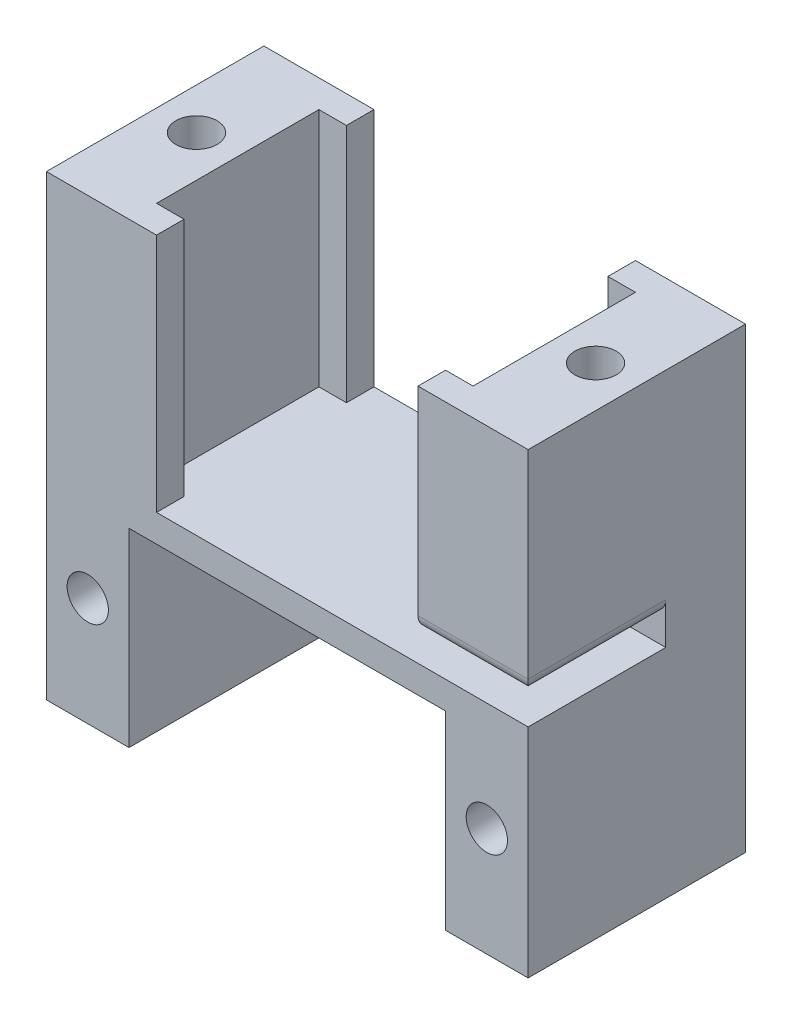
ISO-10303-21;
HEADER;
FILE_DESCRIPTION(('STEP AP214'),'2;1');
FILE_NAME('part.step','',(''),(''),'','','');
FILE_SCHEMA(('AUTOMOTIVE_DESIGN { 1 0 10303 214 1 1 1 1 }'));
ENDSEC;
DATA;
#1=APPLICATION_CONTEXT('core data for automotive mechanical design processes');
#2=APPLICATION_PROTOCOL_DEFINITION('international standard','automotive_design',2000,#1);
#3=PRODUCT_CONTEXT('',#1,'mechanical');
#4=PRODUCT('Part','Part','',(#3));
#5=PRODUCT_RELATED_PRODUCT_CATEGORY('part','',(#4));
#6=PRODUCT_DEFINITION_FORMATION('','',#4);
#7=PRODUCT_DEFINITION_CONTEXT('part definition',#1,'design');
#8=PRODUCT_DEFINITION('design','',#6,#7);
#9=PRODUCT_DEFINITION_SHAPE('','',#8);
#10=(LENGTH_UNIT() NAMED_UNIT(*) SI_UNIT(.MILLI.,.METRE.));
#11=(NAMED_UNIT(*) PLANE_ANGLE_UNIT() SI_UNIT($,.RADIAN.));
#12=(NAMED_UNIT(*) SI_UNIT($,.STERADIAN.) SOLID_ANGLE_UNIT());
#13=UNCERTAINTY_MEASURE_WITH_UNIT(LENGTH_MEASURE(1.E-05),#10,'distance_accuracy_value','');
#14=(GEOMETRIC_REPRESENTATION_CONTEXT(3) GLOBAL_UNCERTAINTY_ASSIGNED_CONTEXT((#13)) GLOBAL_UNIT_ASSIGNED_CONTEXT((#10,
#11,#12)) REPRESENTATION_CONTEXT('',''));
#15=CARTESIAN_POINT('',(0.,0.,0.));
#16=DIRECTION('',(0.,0.,1.));
#17=DIRECTION('',(1.,0.,0.));
#18=AXIS2_PLACEMENT_3D('',#15,#16,#17);
#19=CARTESIAN_POINT('',(0.,-33.25,-23.8511755052723));
#20=DIRECTION('',(0.,1.,0.));
#21=DIRECTION('',(0.,0.,1.));
#22=AXIS2_PLACEMENT_3D('',#19,#20,#21);
#23=PLANE('',#22);
#24=DIRECTION('',(0.,0.,-1.));
#25=VECTOR('',#24,1.);
#26=CARTESIAN_POINT('',(-3.,-33.25,-23.8511755052723));
#27=LINE('',#26,#25);
#28=CARTESIAN_POINT('',(-3.,-33.25,7.9));
#29=VERTEX_POINT('',#28);
#30=CARTESIAN_POINT('',(-3.,-33.25,-6.9));
#31=VERTEX_POINT('',#30);
#32=EDGE_CURVE('E227',#29,#31,#27,.T.);
#33=ORIENTED_EDGE('',*,*,#32,.T.);
#34=CARTESIAN_POINT('',(-2.,-33.25,-6.9));
#35=DIRECTION('',(0.,1.,0.));
#36=DIRECTION('',(0.,0.,1.));
#37=AXIS2_PLACEMENT_3D('',#34,#35,#36);
#38=CIRCLE('',#37,1.);
#39=CARTESIAN_POINT('',(-2.,-33.25,-7.9));
#40=VERTEX_POINT('',#39);
#41=EDGE_CURVE('E410',#31,#40,#38,.F.);
#42=ORIENTED_EDGE('',*,*,#41,.T.);
#43=DIRECTION('',(1.,0.,0.));
#44=VECTOR('',#43,1.);
#45=CARTESIAN_POINT('',(0.,-33.25,-7.9));
#46=LINE('',#45,#44);
#47=CARTESIAN_POINT('',(3.,-33.25,-7.9));
#48=VERTEX_POINT('',#47);
#49=EDGE_CURVE('E250',#40,#48,#46,.T.);
#50=ORIENTED_EDGE('',*,*,#49,.T.);
#51=DIRECTION('',(0.,0.,1.));
#52=VECTOR('',#51,1.);
#53=CARTESIAN_POINT('',(3.,-33.25,-23.8511755052723));
#54=LINE('',#53,#52);
#55=CARTESIAN_POINT('',(3.,-33.25,7.9));
#56=VERTEX_POINT('',#55);
#57=EDGE_CURVE('E428',#48,#56,#54,.T.);
#58=ORIENTED_EDGE('',*,*,#57,.T.);
#59=DIRECTION('',(-1.,0.,0.));
#60=VECTOR('',#59,1.);
#61=CARTESIAN_POINT('',(0.,-33.25,7.9));
#62=LINE('',#61,#60);
#63=EDGE_CURVE('E245',#56,#29,#62,.T.);
#64=ORIENTED_EDGE('',*,*,#63,.T.);
#65=EDGE_LOOP('',(#33,#42,#50,#58,#64));
#66=FACE_BOUND('',#65,.T.);
#67=ADVANCED_FACE('F45',(#66),#23,.F.);
#68=CARTESIAN_POINT('',(0.,-19.45,7.9));
#69=DIRECTION('',(0.,0.,1.));
#70=DIRECTION('',(1.,0.,0.));
#71=AXIS2_PLACEMENT_3D('',#68,#69,#70);
#72=PLANE('',#71);
#73=DIRECTION('',(0.,1.,0.));
#74=VECTOR('',#73,1.);
#75=CARTESIAN_POINT('',(-5.,-19.45,7.9));
#76=LINE('',#75,#74);
#77=CARTESIAN_POINT('',(-5.,-14.45,7.9));
#78=VERTEX_POINT('',#77);
#79=CARTESIAN_POINT('',(-5.,0.,7.9));
#80=VERTEX_POINT('',#79);
#81=EDGE_CURVE('E353',#78,#80,#76,.T.);
#82=ORIENTED_EDGE('',*,*,#81,.F.);
#83=DIRECTION('',(-1.,0.,0.));
#84=VECTOR('',#83,1.);
#85=CARTESIAN_POINT('',(3.,-14.45,7.9));
#86=LINE('',#85,#84);
#87=CARTESIAN_POINT('',(3.,-14.45,7.9));
#88=VERTEX_POINT('',#87);
#89=EDGE_CURVE('E391',#78,#88,#86,.F.);
#90=ORIENTED_EDGE('',*,*,#89,.T.);
#91=DIRECTION('',(0.,1.,0.));
#92=VECTOR('',#91,1.);
#93=CARTESIAN_POINT('',(3.,-19.45,7.9));
#94=LINE('',#93,#92);
#95=CARTESIAN_POINT('',(3.,0.,7.9));
#96=VERTEX_POINT('',#95);
#97=EDGE_CURVE('E352',#88,#96,#94,.T.);
#98=ORIENTED_EDGE('',*,*,#97,.T.);
#99=DIRECTION('',(1.,0.,0.));
#100=VECTOR('',#99,1.);
#101=CARTESIAN_POINT('',(0.,0.,7.9));
#102=LINE('',#101,#100);
#103=EDGE_CURVE('E341',#80,#96,#102,.T.);
#104=ORIENTED_EDGE('',*,*,#103,.F.);
#105=EDGE_LOOP('',(#82,#90,#98,#104));
#106=FACE_BOUND('',#105,.T.);
#107=ADVANCED_FACE('F538',(#106),#72,.T.);
#108=CARTESIAN_POINT('',(0.,-19.45,0.));
#109=DIRECTION('',(0.,1.,0.));
#110=DIRECTION('',(0.,0.,1.));
#111=AXIS2_PLACEMENT_3D('',#108,#109,#110);
#112=PLANE('',#111);
#113=DIRECTION('',(1.,0.,0.));
#114=VECTOR('',#113,1.);
#115=CARTESIAN_POINT('',(0.,-19.45,-7.9));
#116=LINE('',#115,#114);
#117=CARTESIAN_POINT('',(-27.,-19.45,-7.9));
#118=VERTEX_POINT('',#117);
#119=CARTESIAN_POINT('',(-2.,-19.45,-7.9));
#120=VERTEX_POINT('',#119);
#121=EDGE_CURVE('E315',#118,#120,#116,.T.);
#122=ORIENTED_EDGE('',*,*,#121,.T.);
#123=CARTESIAN_POINT('',(-2.,-19.45,-6.9));
#124=DIRECTION('',(0.,1.,0.));
#125=DIRECTION('',(0.,0.,1.));
#126=AXIS2_PLACEMENT_3D('',#123,#124,#125);
#127=CIRCLE('',#126,1.);
#128=CARTESIAN_POINT('',(-3.,-19.45,-6.9));
#129=VERTEX_POINT('',#128);
#130=EDGE_CURVE('E53',#120,#129,#127,.T.);
#131=ORIENTED_EDGE('',*,*,#130,.T.);
#132=DIRECTION('',(0.,0.,1.));
#133=VECTOR('',#132,1.);
#134=CARTESIAN_POINT('',(-3.,-19.45,-23.8511755052723));
#135=LINE('',#134,#133);
#136=CARTESIAN_POINT('',(-3.,-19.45,7.9));
#137=VERTEX_POINT('',#136);
#138=EDGE_CURVE('E418',#129,#137,#135,.T.);
#139=ORIENTED_EDGE('',*,*,#138,.T.);
#140=DIRECTION('',(1.,0.,0.));
#141=VECTOR('',#140,1.);
#142=CARTESIAN_POINT('',(0.,-19.45,7.9));
#143=LINE('',#142,#141);
#144=CARTESIAN_POINT('',(-26.,-19.45,7.9));
#145=VERTEX_POINT('',#144);
#146=EDGE_CURVE('E317',#145,#137,#143,.T.);
#147=ORIENTED_EDGE('',*,*,#146,.F.);
#148=DIRECTION('',(0.,0.,1.));
#149=VECTOR('',#148,1.);
#150=CARTESIAN_POINT('',(-26.,-19.45,-23.8511755052723));
#151=LINE('',#150,#149);
#152=CARTESIAN_POINT('',(-26.,-19.45,-6.9));
#153=VERTEX_POINT('',#152);
#154=EDGE_CURVE('E234',#153,#145,#151,.T.);
#155=ORIENTED_EDGE('',*,*,#154,.F.);
#156=CARTESIAN_POINT('',(-27.,-19.45,-6.9));
#157=DIRECTION('',(0.,1.,0.));
#158=DIRECTION('',(0.,0.,1.));
#159=AXIS2_PLACEMENT_3D('',#156,#157,#158);
#160=CIRCLE('',#159,1.);
#161=EDGE_CURVE('E11',#153,#118,#160,.T.);
#162=ORIENTED_EDGE('',*,*,#161,.T.);
#163=EDGE_LOOP('',(#122,#131,#139,#147,#155,#162));
#164=FACE_BOUND('',#163,.T.);
#165=ADVANCED_FACE('F417',(#164),#112,.F.);
#166=CARTESIAN_POINT('',(0.,-19.45,0.));
#167=DIRECTION('',(0.,1.,0.));
#168=DIRECTION('',(0.,0.,1.));
#169=AXIS2_PLACEMENT_3D('',#166,#167,#168);
#170=CYLINDRICAL_SURFACE('',#169,1.5);
#171=CARTESIAN_POINT('',(0.,0.,0.));
#172=DIRECTION('',(0.,1.,0.));
#173=DIRECTION('',(0.,0.,1.));
#174=AXIS2_PLACEMENT_3D('',#171,#172,#173);
#175=CIRCLE('',#174,1.5);
#176=CARTESIAN_POINT('',(0.,0.,1.5));
#177=VERTEX_POINT('',#176);
#178=EDGE_CURVE('E314',#177,#177,#175,.T.);
#179=ORIENTED_EDGE('',*,*,#178,.T.);
#180=EDGE_LOOP('',(#179));
#181=FACE_BOUND('',#180,.T.);
#182=CARTESIAN_POINT('',(0.,-14.45,0.));
#183=DIRECTION('',(0.,-1.,0.));
#184=DIRECTION('',(0.,0.,-1.));
#185=AXIS2_PLACEMENT_3D('',#182,#183,#184);
#186=CIRCLE('',#185,1.5);
#187=CARTESIAN_POINT('',(0.,-14.45,-1.5));
#188=VERTEX_POINT('',#187);
#189=EDGE_CURVE('E348',#188,#188,#186,.F.);
#190=ORIENTED_EDGE('',*,*,#189,.F.);
#191=EDGE_LOOP('',(#190));
#192=FACE_BOUND('',#191,.T.);
#193=ADVANCED_FACE('F606',(#181,#192),#170,.F.);
#194=CARTESIAN_POINT('',(0.,-19.45,-7.9));
#195=DIRECTION('',(0.,0.,1.));
#196=DIRECTION('',(1.,0.,0.));
#197=AXIS2_PLACEMENT_3D('',#194,#195,#196);
#198=PLANE('',#197);
#199=ORIENTED_EDGE('',*,*,#49,.F.);
#200=DIRECTION('',(0.,1.,0.));
#201=VECTOR('',#200,1.);
#202=CARTESIAN_POINT('',(-2.,-19.45,-7.9));
#203=LINE('',#202,#201);
#204=EDGE_CURVE('E405',#40,#120,#203,.T.);
#205=ORIENTED_EDGE('',*,*,#204,.T.);
#206=ORIENTED_EDGE('',*,*,#121,.F.);
#207=DIRECTION('',(0.,1.,0.));
#208=VECTOR('',#207,1.);
#209=CARTESIAN_POINT('',(-27.,-19.45,-7.9));
#210=LINE('',#209,#208);
#211=CARTESIAN_POINT('',(-27.,-33.25,-7.9));
#212=VERTEX_POINT('',#211);
#213=EDGE_CURVE('E403',#118,#212,#210,.F.);
#214=ORIENTED_EDGE('',*,*,#213,.T.);
#215=CARTESIAN_POINT('',(-32.,-33.25,-7.9));
#216=VERTEX_POINT('',#215);
#217=EDGE_CURVE('E246',#216,#212,#46,.T.);
#218=ORIENTED_EDGE('',*,*,#217,.F.);
#219=DIRECTION('',(0.,-1.,0.));
#220=VECTOR('',#219,1.);
#221=CARTESIAN_POINT('',(-32.,-17.45,-7.9));
#222=LINE('',#221,#220);
#223=CARTESIAN_POINT('',(-32.,0.,-7.9));
#224=VERTEX_POINT('',#223);
#225=EDGE_CURVE('E306',#224,#216,#222,.T.);
#226=ORIENTED_EDGE('',*,*,#225,.F.);
#227=DIRECTION('',(-1.,0.,0.));
#228=VECTOR('',#227,1.);
#229=CARTESIAN_POINT('',(-29.,0.,-7.9));
#230=LINE('',#229,#228);
#231=CARTESIAN_POINT('',(-24.,0.,-7.9));
#232=VERTEX_POINT('',#231);
#233=EDGE_CURVE('E263',#232,#224,#230,.T.);
#234=ORIENTED_EDGE('',*,*,#233,.F.);
#235=DIRECTION('',(0.,1.,0.));
#236=VECTOR('',#235,1.);
#237=CARTESIAN_POINT('',(-24.,-19.45,-7.9));
#238=LINE('',#237,#236);
#239=CARTESIAN_POINT('',(-24.,-17.45,-7.9));
#240=VERTEX_POINT('',#239);
#241=EDGE_CURVE('E286',#240,#232,#238,.T.);
#242=ORIENTED_EDGE('',*,*,#241,.F.);
#243=DIRECTION('',(1.,0.,0.));
#244=VECTOR('',#243,1.);
#245=CARTESIAN_POINT('',(3.,-17.45,-7.9));
#246=LINE('',#245,#244);
#247=CARTESIAN_POINT('',(-5.,-17.45,-7.9));
#248=VERTEX_POINT('',#247);
#249=EDGE_CURVE('E301',#240,#248,#246,.T.);
#250=ORIENTED_EDGE('',*,*,#249,.T.);
#251=DIRECTION('',(0.,1.,0.));
#252=VECTOR('',#251,1.);
#253=CARTESIAN_POINT('',(-5.,-19.45,-7.9));
#254=LINE('',#253,#252);
#255=CARTESIAN_POINT('',(-5.,0.,-7.9));
#256=VERTEX_POINT('',#255);
#257=EDGE_CURVE('E320',#248,#256,#254,.T.);
#258=ORIENTED_EDGE('',*,*,#257,.T.);
#259=DIRECTION('',(1.,0.,0.));
#260=VECTOR('',#259,1.);
#261=CARTESIAN_POINT('',(0.,0.,-7.9));
#262=LINE('',#261,#260);
#263=CARTESIAN_POINT('',(3.,0.,-7.9));
#264=VERTEX_POINT('',#263);
#265=EDGE_CURVE('E323',#256,#264,#262,.T.);
#266=ORIENTED_EDGE('',*,*,#265,.T.);
#267=DIRECTION('',(0.,1.,0.));
#268=VECTOR('',#267,1.);
#269=CARTESIAN_POINT('',(3.,-19.45,-7.9));
#270=LINE('',#269,#268);
#271=EDGE_CURVE('E346',#48,#264,#270,.T.);
#272=ORIENTED_EDGE('',*,*,#271,.F.);
#273=EDGE_LOOP('',(#199,#205,#206,#214,#218,#226,#234,#242,#250,#258,#266,#272));
#274=FACE_BOUND('',#273,.T.);
#275=CARTESIAN_POINT('',(-29.,-25.35,-7.9));
#276=DIRECTION('',(0.,0.,1.));
#277=DIRECTION('',(1.,0.,0.));
#278=AXIS2_PLACEMENT_3D('',#275,#276,#277);
#279=CIRCLE('',#278,1.5);
#280=CARTESIAN_POINT('',(-27.5,-25.35,-7.9));
#281=VERTEX_POINT('',#280);
#282=EDGE_CURVE('E257',#281,#281,#279,.T.);
#283=ORIENTED_EDGE('',*,*,#282,.T.);
#284=EDGE_LOOP('',(#283));
#285=FACE_BOUND('',#284,.T.);
#286=CARTESIAN_POINT('',(0.,-25.35,-7.9));
#287=DIRECTION('',(0.,0.,1.));
#288=DIRECTION('',(1.,0.,0.));
#289=AXIS2_PLACEMENT_3D('',#286,#287,#288);
#290=CIRCLE('',#289,1.5);
#291=CARTESIAN_POINT('',(1.5,-25.35,-7.9));
#292=VERTEX_POINT('',#291);
#293=EDGE_CURVE('E427',#292,#292,#290,.F.);
#294=ORIENTED_EDGE('',*,*,#293,.F.);
#295=EDGE_LOOP('',(#294));
#296=FACE_BOUND('',#295,.T.);
#297=ADVANCED_FACE('F437',(#274,#285,#296),#198,.F.);
#298=CARTESIAN_POINT('',(3.,-19.45,0.));
#299=DIRECTION('',(1.,0.,0.));
#300=DIRECTION('',(0.,0.,-1.));
#301=AXIS2_PLACEMENT_3D('',#298,#299,#300);
#302=PLANE('',#301);
#303=ORIENTED_EDGE('',*,*,#97,.F.);
#304=DIRECTION('',(0.,0.,1.));
#305=VECTOR('',#304,1.);
#306=CARTESIAN_POINT('',(3.,-14.45,-2.1));
#307=LINE('',#306,#305);
#308=CARTESIAN_POINT('',(3.00000000000001,-14.45,-2.1));
#309=VERTEX_POINT('',#308);
#310=EDGE_CURVE('E393',#88,#309,#307,.F.);
#311=ORIENTED_EDGE('',*,*,#310,.T.);
#312=DIRECTION('',(0.,1.,0.));
#313=VECTOR('',#312,1.);
#314=CARTESIAN_POINT('',(3.,-17.45,-2.1));
#315=LINE('',#314,#313);
#316=CARTESIAN_POINT('',(3.,-17.45,-2.1));
#317=VERTEX_POINT('',#316);
#318=EDGE_CURVE('E465',#317,#309,#315,.T.);
#319=ORIENTED_EDGE('',*,*,#318,.F.);
#320=DIRECTION('',(0.,0.,1.));
#321=VECTOR('',#320,1.);
#322=CARTESIAN_POINT('',(3.,-17.45,-2.1));
#323=LINE('',#322,#321);
#324=CARTESIAN_POINT('',(3.,-17.45,7.9));
#325=VERTEX_POINT('',#324);
#326=EDGE_CURVE('E458',#317,#325,#323,.T.);
#327=ORIENTED_EDGE('',*,*,#326,.T.);
#328=EDGE_CURVE('E349',#56,#325,#94,.T.);
#329=ORIENTED_EDGE('',*,*,#328,.F.);
#330=ORIENTED_EDGE('',*,*,#57,.F.);
#331=ORIENTED_EDGE('',*,*,#271,.T.);
#332=DIRECTION('',(0.,0.,-1.));
#333=VECTOR('',#332,1.);
#334=CARTESIAN_POINT('',(3.,0.,0.));
#335=LINE('',#334,#333);
#336=EDGE_CURVE('E318',#96,#264,#335,.T.);
#337=ORIENTED_EDGE('',*,*,#336,.F.);
#338=EDGE_LOOP('',(#303,#311,#319,#327,#329,#330,#331,#337));
#339=FACE_BOUND('',#338,.T.);
#340=ADVANCED_FACE('F478',(#339),#302,.T.);
#341=DIRECTION('',(0.,-1.,0.));
#342=VECTOR('',#341,1.);
#343=CARTESIAN_POINT('',(-3.,0.,7.9));
#344=LINE('',#343,#342);
#345=EDGE_CURVE('E426',#137,#29,#344,.T.);
#346=ORIENTED_EDGE('',*,*,#345,.T.);
#347=ORIENTED_EDGE('',*,*,#63,.F.);
#348=ORIENTED_EDGE('',*,*,#328,.T.);
#349=DIRECTION('',(-1.,0.,0.));
#350=VECTOR('',#349,1.);
#351=CARTESIAN_POINT('',(-32.,-17.45,7.9));
#352=LINE('',#351,#350);
#353=CARTESIAN_POINT('',(-24.,-17.45,7.9));
#354=VERTEX_POINT('',#353);
#355=EDGE_CURVE('E303',#325,#354,#352,.T.);
#356=ORIENTED_EDGE('',*,*,#355,.T.);
#357=DIRECTION('',(0.,1.,0.));
#358=VECTOR('',#357,1.);
#359=CARTESIAN_POINT('',(-24.,-19.45,7.9));
#360=LINE('',#359,#358);
#361=CARTESIAN_POINT('',(-24.,0.,7.9));
#362=VERTEX_POINT('',#361);
#363=EDGE_CURVE('E287',#354,#362,#360,.T.);
#364=ORIENTED_EDGE('',*,*,#363,.T.);
#365=DIRECTION('',(-1.,0.,0.));
#366=VECTOR('',#365,1.);
#367=CARTESIAN_POINT('',(-29.,0.,7.9));
#368=LINE('',#367,#366);
#369=CARTESIAN_POINT('',(-32.,0.,7.9));
#370=VERTEX_POINT('',#369);
#371=EDGE_CURVE('E281',#362,#370,#368,.T.);
#372=ORIENTED_EDGE('',*,*,#371,.T.);
#373=DIRECTION('',(0.,-1.,0.));
#374=VECTOR('',#373,1.);
#375=CARTESIAN_POINT('',(-32.,-17.45,7.9));
#376=LINE('',#375,#374);
#377=CARTESIAN_POINT('',(-32.,-33.25,7.9));
#378=VERTEX_POINT('',#377);
#379=EDGE_CURVE('E243',#370,#378,#376,.T.);
#380=ORIENTED_EDGE('',*,*,#379,.T.);
#381=CARTESIAN_POINT('',(-26.,-33.25,7.9));
#382=VERTEX_POINT('',#381);
#383=EDGE_CURVE('E224',#382,#378,#62,.T.);
#384=ORIENTED_EDGE('',*,*,#383,.F.);
#385=DIRECTION('',(0.,-1.,0.));
#386=VECTOR('',#385,1.);
#387=CARTESIAN_POINT('',(-26.,0.,7.9));
#388=LINE('',#387,#386);
#389=EDGE_CURVE('E231',#145,#382,#388,.T.);
#390=ORIENTED_EDGE('',*,*,#389,.F.);
#391=ORIENTED_EDGE('',*,*,#146,.T.);
#392=EDGE_LOOP('',(#346,#347,#348,#356,#364,#372,#380,#384,#390,#391));
#393=FACE_BOUND('',#392,.T.);
#394=CARTESIAN_POINT('',(-29.,-25.35,7.9));
#395=DIRECTION('',(0.,0.,1.));
#396=DIRECTION('',(1.,0.,0.));
#397=AXIS2_PLACEMENT_3D('',#394,#395,#396);
#398=CIRCLE('',#397,1.5);
#399=CARTESIAN_POINT('',(-27.5,-25.35,7.9));
#400=VERTEX_POINT('',#399);
#401=EDGE_CURVE('E238',#400,#400,#398,.F.);
#402=ORIENTED_EDGE('',*,*,#401,.T.);
#403=EDGE_LOOP('',(#402));
#404=FACE_BOUND('',#403,.T.);
#405=CARTESIAN_POINT('',(0.,-25.35,7.9));
#406=DIRECTION('',(0.,0.,1.));
#407=DIRECTION('',(1.,0.,0.));
#408=AXIS2_PLACEMENT_3D('',#405,#406,#407);
#409=CIRCLE('',#408,1.5);
#410=CARTESIAN_POINT('',(1.5,-25.35,7.9));
#411=VERTEX_POINT('',#410);
#412=EDGE_CURVE('E440',#411,#411,#409,.T.);
#413=ORIENTED_EDGE('',*,*,#412,.F.);
#414=EDGE_LOOP('',(#413));
#415=FACE_BOUND('',#414,.T.);
#416=ADVANCED_FACE('F240',(#393,#404,#415),#72,.T.);
#417=CARTESIAN_POINT('',(-5.,-19.45,0.));
#418=DIRECTION('',(-1.,0.,0.));
#419=DIRECTION('',(0.,0.,1.));
#420=AXIS2_PLACEMENT_3D('',#417,#418,#419);
#421=PLANE('',#420);
#422=DIRECTION('',(0.,0.,1.));
#423=VECTOR('',#422,1.);
#424=CARTESIAN_POINT('',(-5.,-15.45,-2.1));
#425=LINE('',#424,#423);
#426=CARTESIAN_POINT('',(-5.,-15.45,5.9));
#427=VERTEX_POINT('',#426);
#428=CARTESIAN_POINT('',(-5.,-15.45,6.9));
#429=VERTEX_POINT('',#428);
#430=EDGE_CURVE('E454',#427,#429,#425,.T.);
#431=ORIENTED_EDGE('',*,*,#430,.T.);
#432=CARTESIAN_POINT('',(-5.,-14.45,6.9));
#433=DIRECTION('',(-1.,0.,0.));
#434=DIRECTION('',(0.,0.,1.));
#435=AXIS2_PLACEMENT_3D('',#432,#433,#434);
#436=CIRCLE('',#435,1.);
#437=EDGE_CURVE('E389',#429,#78,#436,.T.);
#438=ORIENTED_EDGE('',*,*,#437,.T.);
#439=ORIENTED_EDGE('',*,*,#81,.T.);
#440=DIRECTION('',(0.,0.,1.));
#441=VECTOR('',#440,1.);
#442=CARTESIAN_POINT('',(-5.,0.,0.));
#443=LINE('',#442,#441);
#444=CARTESIAN_POINT('',(-5.,0.,5.9));
#445=VERTEX_POINT('',#444);
#446=EDGE_CURVE('E338',#445,#80,#443,.T.);
#447=ORIENTED_EDGE('',*,*,#446,.F.);
#448=DIRECTION('',(0.,1.,0.));
#449=VECTOR('',#448,1.);
#450=CARTESIAN_POINT('',(-5.,-19.45,5.9));
#451=LINE('',#450,#449);
#452=EDGE_CURVE('E355',#427,#445,#451,.T.);
#453=ORIENTED_EDGE('',*,*,#452,.F.);
#454=EDGE_LOOP('',(#431,#438,#439,#447,#453));
#455=FACE_BOUND('',#454,.T.);
#456=ADVANCED_FACE('F544',(#455),#421,.T.);
#457=CARTESIAN_POINT('',(0.,-19.45,5.9));
#458=DIRECTION('',(0.,0.,-1.));
#459=DIRECTION('',(-1.,0.,0.));
#460=AXIS2_PLACEMENT_3D('',#457,#458,#459);
#461=PLANE('',#460);
#462=DIRECTION('',(1.,0.,0.));
#463=VECTOR('',#462,1.);
#464=CARTESIAN_POINT('',(0.,-15.45,5.9));
#465=LINE('',#464,#463);
#466=CARTESIAN_POINT('',(-3.,-15.45,5.9));
#467=VERTEX_POINT('',#466);
#468=EDGE_CURVE('E445',#427,#467,#465,.T.);
#469=ORIENTED_EDGE('',*,*,#468,.F.);
#470=ORIENTED_EDGE('',*,*,#452,.T.);
#471=DIRECTION('',(-1.,0.,0.));
#472=VECTOR('',#471,1.);
#473=CARTESIAN_POINT('',(0.,0.,5.9));
#474=LINE('',#473,#472);
#475=CARTESIAN_POINT('',(-3.,0.,5.9));
#476=VERTEX_POINT('',#475);
#477=EDGE_CURVE('E335',#476,#445,#474,.T.);
#478=ORIENTED_EDGE('',*,*,#477,.F.);
#479=DIRECTION('',(0.,1.,0.));
#480=VECTOR('',#479,1.);
#481=CARTESIAN_POINT('',(-3.,-19.45,5.9));
#482=LINE('',#481,#480);
#483=EDGE_CURVE('E357',#467,#476,#482,.T.);
#484=ORIENTED_EDGE('',*,*,#483,.F.);
#485=EDGE_LOOP('',(#469,#470,#478,#484));
#486=FACE_BOUND('',#485,.T.);
#487=ADVANCED_FACE('F493',(#486),#461,.T.);
#488=CARTESIAN_POINT('',(-3.,-19.45,0.));
#489=DIRECTION('',(-1.,0.,0.));
#490=DIRECTION('',(0.,0.,1.));
#491=AXIS2_PLACEMENT_3D('',#488,#489,#490);
#492=PLANE('',#491);
#493=DIRECTION('',(0.,0.,-1.));
#494=VECTOR('',#493,1.);
#495=CARTESIAN_POINT('',(-3.,-15.45,0.));
#496=LINE('',#495,#494);
#497=CARTESIAN_POINT('',(-3.,-15.45,-2.1));
#498=VERTEX_POINT('',#497);
#499=EDGE_CURVE('E381',#467,#498,#496,.T.);
#500=ORIENTED_EDGE('',*,*,#499,.F.);
#501=ORIENTED_EDGE('',*,*,#483,.T.);
#502=DIRECTION('',(0.,0.,1.));
#503=VECTOR('',#502,1.);
#504=CARTESIAN_POINT('',(-3.,0.,0.));
#505=LINE('',#504,#503);
#506=CARTESIAN_POINT('',(-3.,0.,-5.9));
#507=VERTEX_POINT('',#506);
#508=EDGE_CURVE('E332',#507,#476,#505,.T.);
#509=ORIENTED_EDGE('',*,*,#508,.F.);
#510=DIRECTION('',(0.,1.,0.));
#511=VECTOR('',#510,1.);
#512=CARTESIAN_POINT('',(-3.,-19.45,-5.9));
#513=LINE('',#512,#511);
#514=CARTESIAN_POINT('',(-3.,-17.45,-5.9));
#515=VERTEX_POINT('',#514);
#516=EDGE_CURVE('E359',#515,#507,#513,.T.);
#517=ORIENTED_EDGE('',*,*,#516,.F.);
#518=DIRECTION('',(0.,0.,-1.));
#519=VECTOR('',#518,1.);
#520=CARTESIAN_POINT('',(-3.,-17.45,0.));
#521=LINE('',#520,#519);
#522=CARTESIAN_POINT('',(-3.,-17.45,-2.1));
#523=VERTEX_POINT('',#522);
#524=EDGE_CURVE('E312',#523,#515,#521,.T.);
#525=ORIENTED_EDGE('',*,*,#524,.F.);
#526=DIRECTION('',(0.,1.,0.));
#527=VECTOR('',#526,1.);
#528=CARTESIAN_POINT('',(-3.,-19.45,-2.1));
#529=LINE('',#528,#527);
#530=EDGE_CURVE('E449',#523,#498,#529,.T.);
#531=ORIENTED_EDGE('',*,*,#530,.T.);
#532=EDGE_LOOP('',(#500,#501,#509,#517,#525,#531));
#533=FACE_BOUND('',#532,.T.);
#534=ADVANCED_FACE('F489',(#533),#492,.T.);
#535=CARTESIAN_POINT('',(0.,-19.45,-5.9));
#536=DIRECTION('',(0.,0.,-1.));
#537=DIRECTION('',(-1.,0.,0.));
#538=AXIS2_PLACEMENT_3D('',#535,#536,#537);
#539=PLANE('',#538);
#540=DIRECTION('',(0.,1.,0.));
#541=VECTOR('',#540,1.);
#542=CARTESIAN_POINT('',(-5.,-19.45,-5.9));
#543=LINE('',#542,#541);
#544=CARTESIAN_POINT('',(-5.,-17.45,-5.9));
#545=VERTEX_POINT('',#544);
#546=CARTESIAN_POINT('',(-5.,0.,-5.9));
#547=VERTEX_POINT('',#546);
#548=EDGE_CURVE('E361',#545,#547,#543,.T.);
#549=ORIENTED_EDGE('',*,*,#548,.F.);
#550=DIRECTION('',(1.,0.,0.));
#551=VECTOR('',#550,1.);
#552=CARTESIAN_POINT('',(0.,-17.45,-5.9));
#553=LINE('',#552,#551);
#554=EDGE_CURVE('E308',#545,#515,#553,.T.);
#555=ORIENTED_EDGE('',*,*,#554,.T.);
#556=ORIENTED_EDGE('',*,*,#516,.T.);
#557=DIRECTION('',(-1.,0.,0.));
#558=VECTOR('',#557,1.);
#559=CARTESIAN_POINT('',(0.,0.,-5.9));
#560=LINE('',#559,#558);
#561=EDGE_CURVE('E329',#507,#547,#560,.T.);
#562=ORIENTED_EDGE('',*,*,#561,.T.);
#563=EDGE_LOOP('',(#549,#555,#556,#562));
#564=FACE_BOUND('',#563,.T.);
#565=ADVANCED_FACE('F504',(#564),#539,.F.);
#566=CARTESIAN_POINT('',(-5.,-19.45,0.));
#567=DIRECTION('',(1.,0.,0.));
#568=DIRECTION('',(0.,0.,-1.));
#569=AXIS2_PLACEMENT_3D('',#566,#567,#568);
#570=PLANE('',#569);
#571=ORIENTED_EDGE('',*,*,#257,.F.);
#572=DIRECTION('',(0.,0.,1.));
#573=VECTOR('',#572,1.);
#574=CARTESIAN_POINT('',(-5.,-17.45,0.));
#575=LINE('',#574,#573);
#576=EDGE_CURVE('E366',#248,#545,#575,.T.);
#577=ORIENTED_EDGE('',*,*,#576,.T.);
#578=ORIENTED_EDGE('',*,*,#548,.T.);
#579=DIRECTION('',(0.,0.,-1.));
#580=VECTOR('',#579,1.);
#581=CARTESIAN_POINT('',(-5.,0.,0.));
#582=LINE('',#581,#580);
#583=EDGE_CURVE('E326',#547,#256,#582,.T.);
#584=ORIENTED_EDGE('',*,*,#583,.T.);
#585=EDGE_LOOP('',(#571,#577,#578,#584));
#586=FACE_BOUND('',#585,.T.);
#587=ADVANCED_FACE('F509',(#586),#570,.F.);
#588=CARTESIAN_POINT('',(0.,0.,0.));
#589=DIRECTION('',(0.,1.,0.));
#590=DIRECTION('',(0.,0.,1.));
#591=AXIS2_PLACEMENT_3D('',#588,#589,#590);
#592=PLANE('',#591);
#593=ORIENTED_EDGE('',*,*,#178,.F.);
#594=EDGE_LOOP('',(#593));
#595=FACE_BOUND('',#594,.T.);
#596=ORIENTED_EDGE('',*,*,#265,.F.);
#597=ORIENTED_EDGE('',*,*,#583,.F.);
#598=ORIENTED_EDGE('',*,*,#561,.F.);
#599=ORIENTED_EDGE('',*,*,#508,.T.);
#600=ORIENTED_EDGE('',*,*,#477,.T.);
#601=ORIENTED_EDGE('',*,*,#446,.T.);
#602=ORIENTED_EDGE('',*,*,#103,.T.);
#603=ORIENTED_EDGE('',*,*,#336,.T.);
#604=EDGE_LOOP('',(#596,#597,#598,#599,#600,#601,#602,#603));
#605=FACE_BOUND('',#604,.T.);
#606=ADVANCED_FACE('F499',(#595,#605),#592,.T.);
#607=CARTESIAN_POINT('',(0.,-14.45,0.));
#608=DIRECTION('',(0.,-1.,0.));
#609=DIRECTION('',(0.,0.,-1.));
#610=AXIS2_PLACEMENT_3D('',#607,#608,#609);
#611=PLANE('',#610);
#612=ORIENTED_EDGE('',*,*,#189,.T.);
#613=EDGE_LOOP('',(#612));
#614=FACE_BOUND('',#613,.T.);
#615=ADVANCED_FACE('F600',(#614),#611,.F.);
#616=CARTESIAN_POINT('',(-32.,-17.45,-7.9));
#617=DIRECTION('',(-1.,0.,0.));
#618=DIRECTION('',(0.,0.,1.));
#619=AXIS2_PLACEMENT_3D('',#616,#617,#618);
#620=PLANE('',#619);
#621=ORIENTED_EDGE('',*,*,#225,.T.);
#622=DIRECTION('',(0.,0.,1.));
#623=VECTOR('',#622,1.);
#624=CARTESIAN_POINT('',(-32.,-33.25,-23.8511755052723));
#625=LINE('',#624,#623);
#626=EDGE_CURVE('E249',#216,#378,#625,.T.);
#627=ORIENTED_EDGE('',*,*,#626,.T.);
#628=ORIENTED_EDGE('',*,*,#379,.F.);
#629=DIRECTION('',(0.,0.,-1.));
#630=VECTOR('',#629,1.);
#631=CARTESIAN_POINT('',(-32.,0.,0.));
#632=LINE('',#631,#630);
#633=EDGE_CURVE('E283',#370,#224,#632,.T.);
#634=ORIENTED_EDGE('',*,*,#633,.T.);
#635=EDGE_LOOP('',(#621,#627,#628,#634));
#636=FACE_BOUND('',#635,.T.);
#637=ADVANCED_FACE('F598',(#636),#620,.T.);
#638=CARTESIAN_POINT('',(0.,-17.45,0.));
#639=DIRECTION('',(0.,1.,0.));
#640=DIRECTION('',(0.,0.,1.));
#641=AXIS2_PLACEMENT_3D('',#638,#639,#640);
#642=PLANE('',#641);
#643=DIRECTION('',(1.,0.,0.));
#644=VECTOR('',#643,1.);
#645=CARTESIAN_POINT('',(-5.,-17.45,-2.1));
#646=LINE('',#645,#644);
#647=EDGE_CURVE('E399',#523,#317,#646,.T.);
#648=ORIENTED_EDGE('',*,*,#647,.F.);
#649=ORIENTED_EDGE('',*,*,#524,.T.);
#650=ORIENTED_EDGE('',*,*,#554,.F.);
#651=ORIENTED_EDGE('',*,*,#576,.F.);
#652=ORIENTED_EDGE('',*,*,#249,.F.);
#653=DIRECTION('',(0.,0.,1.));
#654=VECTOR('',#653,1.);
#655=CARTESIAN_POINT('',(-24.,-17.45,0.));
#656=LINE('',#655,#654);
#657=CARTESIAN_POINT('',(-24.,-17.45,-5.9));
#658=VERTEX_POINT('',#657);
#659=EDGE_CURVE('E369',#240,#658,#656,.T.);
#660=ORIENTED_EDGE('',*,*,#659,.T.);
#661=DIRECTION('',(-1.,0.,0.));
#662=VECTOR('',#661,1.);
#663=CARTESIAN_POINT('',(0.,-17.45,-5.9));
#664=LINE('',#663,#662);
#665=CARTESIAN_POINT('',(-26.,-17.45,-5.9));
#666=VERTEX_POINT('',#665);
#667=EDGE_CURVE('E372',#658,#666,#664,.T.);
#668=ORIENTED_EDGE('',*,*,#667,.T.);
#669=DIRECTION('',(0.,0.,-1.));
#670=VECTOR('',#669,1.);
#671=CARTESIAN_POINT('',(-26.,-17.45,0.));
#672=LINE('',#671,#670);
#673=CARTESIAN_POINT('',(-26.,-17.45,5.9));
#674=VERTEX_POINT('',#673);
#675=EDGE_CURVE('E375',#674,#666,#672,.T.);
#676=ORIENTED_EDGE('',*,*,#675,.F.);
#677=DIRECTION('',(-1.,0.,0.));
#678=VECTOR('',#677,1.);
#679=CARTESIAN_POINT('',(0.,-17.45,5.9));
#680=LINE('',#679,#678);
#681=CARTESIAN_POINT('',(-24.,-17.45,5.9));
#682=VERTEX_POINT('',#681);
#683=EDGE_CURVE('E377',#682,#674,#680,.T.);
#684=ORIENTED_EDGE('',*,*,#683,.F.);
#685=DIRECTION('',(0.,0.,-1.));
#686=VECTOR('',#685,1.);
#687=CARTESIAN_POINT('',(-24.,-17.45,0.));
#688=LINE('',#687,#686);
#689=EDGE_CURVE('E379',#354,#682,#688,.T.);
#690=ORIENTED_EDGE('',*,*,#689,.F.);
#691=ORIENTED_EDGE('',*,*,#355,.F.);
#692=ORIENTED_EDGE('',*,*,#326,.F.);
#693=EDGE_LOOP('',(#648,#649,#650,#651,#652,#660,#668,#676,#684,#690,#691,#692));
#694=FACE_BOUND('',#693,.T.);
#695=ADVANCED_FACE('F473',(#694),#642,.T.);
#696=CARTESIAN_POINT('',(-29.,-19.45,0.));
#697=DIRECTION('',(0.,1.,0.));
#698=DIRECTION('',(0.,0.,1.));
#699=AXIS2_PLACEMENT_3D('',#696,#697,#698);
#700=CYLINDRICAL_SURFACE('',#699,1.5);
#701=CARTESIAN_POINT('',(-29.,0.,0.));
#702=DIRECTION('',(0.,-1.,0.));
#703=DIRECTION('',(0.,0.,1.));
#704=AXIS2_PLACEMENT_3D('',#701,#702,#703);
#705=CIRCLE('',#704,1.5);
#706=CARTESIAN_POINT('',(-29.,0.,1.5));
#707=VERTEX_POINT('',#706);
#708=EDGE_CURVE('E260',#707,#707,#705,.T.);
#709=ORIENTED_EDGE('',*,*,#708,.F.);
#710=EDGE_LOOP('',(#709));
#711=FACE_BOUND('',#710,.T.);
#712=CARTESIAN_POINT('',(-29.,-14.45,0.));
#713=DIRECTION('',(0.,1.,0.));
#714=DIRECTION('',(0.,0.,-1.));
#715=AXIS2_PLACEMENT_3D('',#712,#713,#714);
#716=CIRCLE('',#715,1.5);
#717=CARTESIAN_POINT('',(-29.,-14.45,-1.5));
#718=VERTEX_POINT('',#717);
#719=EDGE_CURVE('E289',#718,#718,#716,.F.);
#720=ORIENTED_EDGE('',*,*,#719,.T.);
#721=EDGE_LOOP('',(#720));
#722=FACE_BOUND('',#721,.T.);
#723=ADVANCED_FACE('F584',(#711,#722),#700,.F.);
#724=CARTESIAN_POINT('',(-24.,-19.45,0.));
#725=DIRECTION('',(1.,0.,0.));
#726=DIRECTION('',(0.,0.,1.));
#727=AXIS2_PLACEMENT_3D('',#724,#725,#726);
#728=PLANE('',#727);
#729=ORIENTED_EDGE('',*,*,#363,.F.);
#730=ORIENTED_EDGE('',*,*,#689,.T.);
#731=DIRECTION('',(0.,1.,0.));
#732=VECTOR('',#731,1.);
#733=CARTESIAN_POINT('',(-24.,-19.45,5.9));
#734=LINE('',#733,#732);
#735=CARTESIAN_POINT('',(-24.,0.,5.9));
#736=VERTEX_POINT('',#735);
#737=EDGE_CURVE('E290',#682,#736,#734,.T.);
#738=ORIENTED_EDGE('',*,*,#737,.T.);
#739=DIRECTION('',(0.,0.,1.));
#740=VECTOR('',#739,1.);
#741=CARTESIAN_POINT('',(-24.,0.,0.));
#742=LINE('',#741,#740);
#743=EDGE_CURVE('E278',#736,#362,#742,.T.);
#744=ORIENTED_EDGE('',*,*,#743,.T.);
#745=EDGE_LOOP('',(#729,#730,#738,#744));
#746=FACE_BOUND('',#745,.T.);
#747=ADVANCED_FACE('F532',(#746),#728,.T.);
#748=CARTESIAN_POINT('',(-29.,-19.45,5.9));
#749=DIRECTION('',(0.,0.,-1.));
#750=DIRECTION('',(1.,0.,0.));
#751=AXIS2_PLACEMENT_3D('',#748,#749,#750);
#752=PLANE('',#751);
#753=ORIENTED_EDGE('',*,*,#737,.F.);
#754=ORIENTED_EDGE('',*,*,#683,.T.);
#755=DIRECTION('',(0.,1.,0.));
#756=VECTOR('',#755,1.);
#757=CARTESIAN_POINT('',(-26.,-19.45,5.9));
#758=LINE('',#757,#756);
#759=CARTESIAN_POINT('',(-26.,0.,5.9));
#760=VERTEX_POINT('',#759);
#761=EDGE_CURVE('E292',#674,#760,#758,.T.);
#762=ORIENTED_EDGE('',*,*,#761,.T.);
#763=DIRECTION('',(1.,0.,0.));
#764=VECTOR('',#763,1.);
#765=CARTESIAN_POINT('',(-29.,0.,5.9));
#766=LINE('',#765,#764);
#767=EDGE_CURVE('E275',#760,#736,#766,.T.);
#768=ORIENTED_EDGE('',*,*,#767,.T.);
#769=EDGE_LOOP('',(#753,#754,#762,#768));
#770=FACE_BOUND('',#769,.T.);
#771=ADVANCED_FACE('F529',(#770),#752,.T.);
#772=CARTESIAN_POINT('',(-26.,-19.45,0.));
#773=DIRECTION('',(1.,0.,0.));
#774=DIRECTION('',(0.,0.,1.));
#775=AXIS2_PLACEMENT_3D('',#772,#773,#774);
#776=PLANE('',#775);
#777=ORIENTED_EDGE('',*,*,#761,.F.);
#778=ORIENTED_EDGE('',*,*,#675,.T.);
#779=DIRECTION('',(0.,1.,0.));
#780=VECTOR('',#779,1.);
#781=CARTESIAN_POINT('',(-26.,-19.45,-5.9));
#782=LINE('',#781,#780);
#783=CARTESIAN_POINT('',(-26.,0.,-5.9));
#784=VERTEX_POINT('',#783);
#785=EDGE_CURVE('E294',#666,#784,#782,.T.);
#786=ORIENTED_EDGE('',*,*,#785,.T.);
#787=DIRECTION('',(0.,0.,1.));
#788=VECTOR('',#787,1.);
#789=CARTESIAN_POINT('',(-26.,0.,0.));
#790=LINE('',#789,#788);
#791=EDGE_CURVE('E272',#784,#760,#790,.T.);
#792=ORIENTED_EDGE('',*,*,#791,.T.);
#793=EDGE_LOOP('',(#777,#778,#786,#792));
#794=FACE_BOUND('',#793,.T.);
#795=ADVANCED_FACE('F524',(#794),#776,.T.);
#796=CARTESIAN_POINT('',(-29.,-19.45,-5.9));
#797=DIRECTION('',(0.,0.,-1.));
#798=DIRECTION('',(1.,0.,0.));
#799=AXIS2_PLACEMENT_3D('',#796,#797,#798);
#800=PLANE('',#799);
#801=ORIENTED_EDGE('',*,*,#667,.F.);
#802=DIRECTION('',(0.,1.,0.));
#803=VECTOR('',#802,1.);
#804=CARTESIAN_POINT('',(-24.,-19.45,-5.9));
#805=LINE('',#804,#803);
#806=CARTESIAN_POINT('',(-24.,0.,-5.9));
#807=VERTEX_POINT('',#806);
#808=EDGE_CURVE('E296',#658,#807,#805,.T.);
#809=ORIENTED_EDGE('',*,*,#808,.T.);
#810=DIRECTION('',(1.,0.,0.));
#811=VECTOR('',#810,1.);
#812=CARTESIAN_POINT('',(-29.,0.,-5.9));
#813=LINE('',#812,#811);
#814=EDGE_CURVE('E269',#784,#807,#813,.T.);
#815=ORIENTED_EDGE('',*,*,#814,.F.);
#816=ORIENTED_EDGE('',*,*,#785,.F.);
#817=EDGE_LOOP('',(#801,#809,#815,#816));
#818=FACE_BOUND('',#817,.T.);
#819=ADVANCED_FACE('F520',(#818),#800,.F.);
#820=CARTESIAN_POINT('',(-24.,-19.45,0.));
#821=DIRECTION('',(-1.,0.,0.));
#822=DIRECTION('',(0.,0.,-1.));
#823=AXIS2_PLACEMENT_3D('',#820,#821,#822);
#824=PLANE('',#823);
#825=ORIENTED_EDGE('',*,*,#659,.F.);
#826=ORIENTED_EDGE('',*,*,#241,.T.);
#827=DIRECTION('',(0.,0.,-1.));
#828=VECTOR('',#827,1.);
#829=CARTESIAN_POINT('',(-24.,0.,0.));
#830=LINE('',#829,#828);
#831=EDGE_CURVE('E266',#807,#232,#830,.T.);
#832=ORIENTED_EDGE('',*,*,#831,.F.);
#833=ORIENTED_EDGE('',*,*,#808,.F.);
#834=EDGE_LOOP('',(#825,#826,#832,#833));
#835=FACE_BOUND('',#834,.T.);
#836=ADVANCED_FACE('F515',(#835),#824,.F.);
#837=CARTESIAN_POINT('',(-29.,0.,0.));
#838=DIRECTION('',(0.,1.,0.));
#839=DIRECTION('',(0.,0.,1.));
#840=AXIS2_PLACEMENT_3D('',#837,#838,#839);
#841=PLANE('',#840);
#842=ORIENTED_EDGE('',*,*,#708,.T.);
#843=EDGE_LOOP('',(#842));
#844=FACE_BOUND('',#843,.T.);
#845=ORIENTED_EDGE('',*,*,#233,.T.);
#846=ORIENTED_EDGE('',*,*,#633,.F.);
#847=ORIENTED_EDGE('',*,*,#371,.F.);
#848=ORIENTED_EDGE('',*,*,#743,.F.);
#849=ORIENTED_EDGE('',*,*,#767,.F.);
#850=ORIENTED_EDGE('',*,*,#791,.F.);
#851=ORIENTED_EDGE('',*,*,#814,.T.);
#852=ORIENTED_EDGE('',*,*,#831,.T.);
#853=EDGE_LOOP('',(#845,#846,#847,#848,#849,#850,#851,#852));
#854=FACE_BOUND('',#853,.T.);
#855=ADVANCED_FACE('F571',(#844,#854),#841,.T.);
#856=CARTESIAN_POINT('',(-29.,-14.45,0.));
#857=DIRECTION('',(0.,-1.,0.));
#858=DIRECTION('',(0.,0.,-1.));
#859=AXIS2_PLACEMENT_3D('',#856,#857,#858);
#860=PLANE('',#859);
#861=ORIENTED_EDGE('',*,*,#719,.F.);
#862=EDGE_LOOP('',(#861));
#863=FACE_BOUND('',#862,.T.);
#864=ADVANCED_FACE('F564',(#863),#860,.F.);
#865=ORIENTED_EDGE('',*,*,#217,.T.);
#866=CARTESIAN_POINT('',(-27.,-33.25,-6.9));
#867=DIRECTION('',(0.,1.,0.));
#868=DIRECTION('',(0.,0.,1.));
#869=AXIS2_PLACEMENT_3D('',#866,#867,#868);
#870=CIRCLE('',#869,1.);
#871=CARTESIAN_POINT('',(-26.,-33.25,-6.9));
#872=VERTEX_POINT('',#871);
#873=EDGE_CURVE('E66',#212,#872,#870,.F.);
#874=ORIENTED_EDGE('',*,*,#873,.T.);
#875=DIRECTION('',(0.,0.,1.));
#876=VECTOR('',#875,1.);
#877=CARTESIAN_POINT('',(-26.,-33.25,-23.8511755052723));
#878=LINE('',#877,#876);
#879=EDGE_CURVE('E219',#872,#382,#878,.T.);
#880=ORIENTED_EDGE('',*,*,#879,.T.);
#881=ORIENTED_EDGE('',*,*,#383,.T.);
#882=ORIENTED_EDGE('',*,*,#626,.F.);
#883=EDGE_LOOP('',(#865,#874,#880,#881,#882));
#884=FACE_BOUND('',#883,.T.);
#885=ADVANCED_FACE('F221',(#884),#23,.F.);
#886=CARTESIAN_POINT('',(-26.,0.,-23.8511755052723));
#887=DIRECTION('',(-1.,0.,0.));
#888=DIRECTION('',(0.,0.,1.));
#889=AXIS2_PLACEMENT_3D('',#886,#887,#888);
#890=PLANE('',#889);
#891=ORIENTED_EDGE('',*,*,#879,.F.);
#892=DIRECTION('',(0.,1.,0.));
#893=VECTOR('',#892,1.);
#894=CARTESIAN_POINT('',(-26.,0.,-6.9));
#895=LINE('',#894,#893);
#896=EDGE_CURVE('E412',#872,#153,#895,.T.);
#897=ORIENTED_EDGE('',*,*,#896,.T.);
#898=ORIENTED_EDGE('',*,*,#154,.T.);
#899=ORIENTED_EDGE('',*,*,#389,.T.);
#900=EDGE_LOOP('',(#891,#897,#898,#899));
#901=FACE_BOUND('',#900,.T.);
#902=ADVANCED_FACE('F232',(#901),#890,.F.);
#903=CARTESIAN_POINT('',(-29.,-25.35,-23.8511755052723));
#904=DIRECTION('',(0.,0.,1.));
#905=DIRECTION('',(1.,0.,0.));
#906=AXIS2_PLACEMENT_3D('',#903,#904,#905);
#907=CYLINDRICAL_SURFACE('',#906,1.5);
#908=ORIENTED_EDGE('',*,*,#282,.F.);
#909=EDGE_LOOP('',(#908));
#910=FACE_BOUND('',#909,.T.);
#911=ORIENTED_EDGE('',*,*,#401,.F.);
#912=EDGE_LOOP('',(#911));
#913=FACE_BOUND('',#912,.T.);
#914=ADVANCED_FACE('F569',(#910,#913),#907,.F.);
#915=CARTESIAN_POINT('',(-3.,0.,-23.8511755052723));
#916=DIRECTION('',(-1.,0.,0.));
#917=DIRECTION('',(0.,-1.,0.));
#918=AXIS2_PLACEMENT_3D('',#915,#916,#917);
#919=PLANE('',#918);
#920=ORIENTED_EDGE('',*,*,#138,.F.);
#921=DIRECTION('',(0.,1.,0.));
#922=VECTOR('',#921,1.);
#923=CARTESIAN_POINT('',(-3.,-33.25,-6.9));
#924=LINE('',#923,#922);
#925=EDGE_CURVE('E408',#129,#31,#924,.F.);
#926=ORIENTED_EDGE('',*,*,#925,.T.);
#927=ORIENTED_EDGE('',*,*,#32,.F.);
#928=ORIENTED_EDGE('',*,*,#345,.F.);
#929=EDGE_LOOP('',(#920,#926,#927,#928));
#930=FACE_BOUND('',#929,.T.);
#931=ADVANCED_FACE('F424',(#930),#919,.T.);
#932=CARTESIAN_POINT('',(0.,-25.35,-23.8511755052723));
#933=DIRECTION('',(0.,0.,1.));
#934=DIRECTION('',(1.,0.,0.));
#935=AXIS2_PLACEMENT_3D('',#932,#933,#934);
#936=CYLINDRICAL_SURFACE('',#935,1.5);
#937=ORIENTED_EDGE('',*,*,#293,.T.);
#938=EDGE_LOOP('',(#937));
#939=FACE_BOUND('',#938,.T.);
#940=ORIENTED_EDGE('',*,*,#412,.T.);
#941=EDGE_LOOP('',(#940));
#942=FACE_BOUND('',#941,.T.);
#943=ADVANCED_FACE('F646',(#939,#942),#936,.F.);
#944=CARTESIAN_POINT('',(3.,-15.45,-2.1));
#945=DIRECTION('',(0.,1.,0.));
#946=DIRECTION('',(0.,0.,1.));
#947=AXIS2_PLACEMENT_3D('',#944,#945,#946);
#948=PLANE('',#947);
#949=DIRECTION('',(0.,0.,1.));
#950=VECTOR('',#949,1.);
#951=CARTESIAN_POINT('',(2.,-15.45,7.9));
#952=LINE('',#951,#950);
#953=CARTESIAN_POINT('',(2.,-15.45,-2.1));
#954=VERTEX_POINT('',#953);
#955=CARTESIAN_POINT('',(2.,-15.45,6.9));
#956=VERTEX_POINT('',#955);
#957=EDGE_CURVE('E384',#954,#956,#952,.T.);
#958=ORIENTED_EDGE('',*,*,#957,.T.);
#959=DIRECTION('',(-1.,0.,0.));
#960=VECTOR('',#959,1.);
#961=CARTESIAN_POINT('',(-5.,-15.45,6.9));
#962=LINE('',#961,#960);
#963=EDGE_CURVE('E386',#956,#429,#962,.T.);
#964=ORIENTED_EDGE('',*,*,#963,.T.);
#965=ORIENTED_EDGE('',*,*,#430,.F.);
#966=ORIENTED_EDGE('',*,*,#468,.T.);
#967=ORIENTED_EDGE('',*,*,#499,.T.);
#968=DIRECTION('',(-1.,0.,0.));
#969=VECTOR('',#968,1.);
#970=CARTESIAN_POINT('',(3.,-15.45,-2.1));
#971=LINE('',#970,#969);
#972=EDGE_CURVE('E462',#954,#498,#971,.T.);
#973=ORIENTED_EDGE('',*,*,#972,.F.);
#974=EDGE_LOOP('',(#958,#964,#965,#966,#967,#973));
#975=FACE_BOUND('',#974,.T.);
#976=ADVANCED_FACE('F487',(#975),#948,.F.);
#977=CARTESIAN_POINT('',(0.,0.,-2.1));
#978=DIRECTION('',(0.,0.,1.));
#979=DIRECTION('',(1.,0.,0.));
#980=AXIS2_PLACEMENT_3D('',#977,#978,#979);
#981=PLANE('',#980);
#982=ORIENTED_EDGE('',*,*,#647,.T.);
#983=ORIENTED_EDGE('',*,*,#318,.T.);
#984=CARTESIAN_POINT('',(2.,-14.45,-2.1));
#985=DIRECTION('',(0.,0.,1.));
#986=DIRECTION('',(1.,0.,0.));
#987=AXIS2_PLACEMENT_3D('',#984,#985,#986);
#988=CIRCLE('',#987,1.);
#989=EDGE_CURVE('E228',#309,#954,#988,.F.);
#990=ORIENTED_EDGE('',*,*,#989,.T.);
#991=ORIENTED_EDGE('',*,*,#972,.T.);
#992=ORIENTED_EDGE('',*,*,#530,.F.);
#993=EDGE_LOOP('',(#982,#983,#990,#991,#992));
#994=FACE_BOUND('',#993,.T.);
#995=ADVANCED_FACE('F470',(#994),#981,.T.);
#996=CARTESIAN_POINT('',(2.,-14.45,-2.1));
#997=DIRECTION('',(0.,0.,-1.));
#998=DIRECTION('',(-1.,0.,0.));
#999=AXIS2_PLACEMENT_3D('',#996,#997,#998);
#1000=CYLINDRICAL_SURFACE('',#999,1.);
#1001=ORIENTED_EDGE('',*,*,#989,.F.);
#1002=ORIENTED_EDGE('',*,*,#310,.F.);
#1003=CARTESIAN_POINT('',(2.,-14.45,6.9));
#1004=DIRECTION('',(0.707106781186547,0.,-0.707106781186547));
#1005=DIRECTION('',(-0.707106781186547,0.,-0.707106781186547));
#1006=AXIS2_PLACEMENT_3D('',#1003,#1004,#1005);
#1007=ELLIPSE('',#1006,1.41421356237309,1.);
#1008=EDGE_CURVE('E397',#956,#88,#1007,.F.);
#1009=ORIENTED_EDGE('',*,*,#1008,.F.);
#1010=ORIENTED_EDGE('',*,*,#957,.F.);
#1011=EDGE_LOOP('',(#1001,#1002,#1009,#1010));
#1012=FACE_BOUND('',#1011,.T.);
#1013=ADVANCED_FACE('F485',(#1012),#1000,.T.);
#1014=CARTESIAN_POINT('',(3.,-14.45,6.9));
#1015=DIRECTION('',(1.,0.,0.));
#1016=DIRECTION('',(0.,0.,-1.));
#1017=AXIS2_PLACEMENT_3D('',#1014,#1015,#1016);
#1018=CYLINDRICAL_SURFACE('',#1017,1.);
#1019=ORIENTED_EDGE('',*,*,#1008,.T.);
#1020=ORIENTED_EDGE('',*,*,#89,.F.);
#1021=ORIENTED_EDGE('',*,*,#437,.F.);
#1022=ORIENTED_EDGE('',*,*,#963,.F.);
#1023=EDGE_LOOP('',(#1019,#1020,#1021,#1022));
#1024=FACE_BOUND('',#1023,.T.);
#1025=ADVANCED_FACE('F541',(#1024),#1018,.T.);
#1026=CARTESIAN_POINT('',(-2.,-19.45,-6.9));
#1027=DIRECTION('',(0.,-1.,0.));
#1028=DIRECTION('',(1.,0.,0.));
#1029=AXIS2_PLACEMENT_3D('',#1026,#1027,#1028);
#1030=CYLINDRICAL_SURFACE('',#1029,1.);
#1031=ORIENTED_EDGE('',*,*,#41,.F.);
#1032=ORIENTED_EDGE('',*,*,#925,.F.);
#1033=ORIENTED_EDGE('',*,*,#130,.F.);
#1034=ORIENTED_EDGE('',*,*,#204,.F.);
#1035=EDGE_LOOP('',(#1031,#1032,#1033,#1034));
#1036=FACE_BOUND('',#1035,.T.);
#1037=ADVANCED_FACE('F431',(#1036),#1030,.T.);
#1038=CARTESIAN_POINT('',(-27.,0.,-6.9));
#1039=DIRECTION('',(0.,1.,0.));
#1040=DIRECTION('',(0.,0.,1.));
#1041=AXIS2_PLACEMENT_3D('',#1038,#1039,#1040);
#1042=CYLINDRICAL_SURFACE('',#1041,1.);
#1043=ORIENTED_EDGE('',*,*,#873,.F.);
#1044=ORIENTED_EDGE('',*,*,#213,.F.);
#1045=ORIENTED_EDGE('',*,*,#161,.F.);
#1046=ORIENTED_EDGE('',*,*,#896,.F.);
#1047=EDGE_LOOP('',(#1043,#1044,#1045,#1046));
#1048=FACE_BOUND('',#1047,.T.);
#1049=ADVANCED_FACE('F47',(#1048),#1042,.T.);
#1050=CLOSED_SHELL('',(#67,#107,#165,#193,#297,#340,#416,#456,#487,#534,#565,#587,#606,#615,
#637,#695,#723,#747,#771,#795,#819,#836,#855,#864,#885,#902,#914,#931,#943,#976,#995,#1013,
#1025,#1037,#1049));
#1051=MANIFOLD_SOLID_BREP('B2',#1050);
#1052=ADVANCED_BREP_SHAPE_REPRESENTATION('',(#18,#1051),#14);
#1053=SHAPE_DEFINITION_REPRESENTATION(#9,#1052);
ENDSEC;
END-ISO-10303-21;
